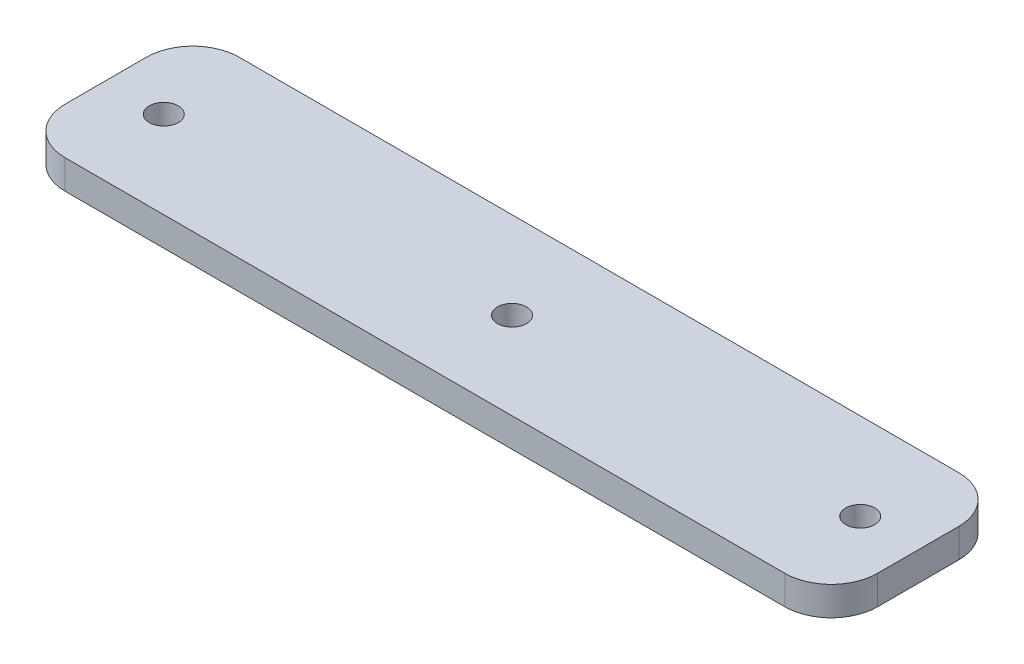
ISO-10303-21;
HEADER;
FILE_DESCRIPTION(('STEP AP214'),'2;1');
FILE_NAME('part.step','',(''),(''),'','','');
FILE_SCHEMA(('AUTOMOTIVE_DESIGN { 1 0 10303 214 1 1 1 1 }'));
ENDSEC;
DATA;
#1=APPLICATION_CONTEXT('core data for automotive mechanical design processes');
#2=APPLICATION_PROTOCOL_DEFINITION('international standard','automotive_design',2000,#1);
#3=PRODUCT_CONTEXT('',#1,'mechanical');
#4=PRODUCT('Part','Part','',(#3));
#5=PRODUCT_RELATED_PRODUCT_CATEGORY('part','',(#4));
#6=PRODUCT_DEFINITION_FORMATION('','',#4);
#7=PRODUCT_DEFINITION_CONTEXT('part definition',#1,'design');
#8=PRODUCT_DEFINITION('design','',#6,#7);
#9=PRODUCT_DEFINITION_SHAPE('','',#8);
#10=(LENGTH_UNIT() NAMED_UNIT(*) SI_UNIT(.MILLI.,.METRE.));
#11=(NAMED_UNIT(*) PLANE_ANGLE_UNIT() SI_UNIT($,.RADIAN.));
#12=(NAMED_UNIT(*) SI_UNIT($,.STERADIAN.) SOLID_ANGLE_UNIT());
#13=UNCERTAINTY_MEASURE_WITH_UNIT(LENGTH_MEASURE(1.E-05),#10,'distance_accuracy_value','');
#14=(GEOMETRIC_REPRESENTATION_CONTEXT(3) GLOBAL_UNCERTAINTY_ASSIGNED_CONTEXT((#13)) GLOBAL_UNIT_ASSIGNED_CONTEXT((#10,
#11,#12)) REPRESENTATION_CONTEXT('',''));
#15=CARTESIAN_POINT('',(0.,0.,0.));
#16=DIRECTION('',(0.,0.,1.));
#17=DIRECTION('',(1.,0.,0.));
#18=AXIS2_PLACEMENT_3D('',#15,#16,#17);
#19=CARTESIAN_POINT('',(167.64,6.35,10.16));
#20=DIRECTION('',(0.,1.,0.));
#21=DIRECTION('',(0.,0.,1.));
#22=AXIS2_PLACEMENT_3D('',#19,#20,#21);
#23=PLANE('',#22);
#24=CARTESIAN_POINT('',(88.9,6.35,19.05));
#25=DIRECTION('',(0.,1.,0.));
#26=DIRECTION('',(0.,0.,1.));
#27=AXIS2_PLACEMENT_3D('',#24,#25,#26);
#28=CIRCLE('',#27,3.175);
#29=CARTESIAN_POINT('',(88.9,6.35,22.225));
#30=VERTEX_POINT('',#29);
#31=EDGE_CURVE('E213',#30,#30,#28,.T.);
#32=ORIENTED_EDGE('',*,*,#31,.F.);
#33=EDGE_LOOP('',(#32));
#34=FACE_BOUND('',#33,.T.);
#35=CARTESIAN_POINT('',(167.64,6.35,10.16));
#36=DIRECTION('',(0.,1.,0.));
#37=DIRECTION('',(0.,0.,1.));
#38=AXIS2_PLACEMENT_3D('',#35,#36,#37);
#39=CIRCLE('',#38,10.16);
#40=CARTESIAN_POINT('',(177.8,6.35,10.16));
#41=VERTEX_POINT('',#40);
#42=CARTESIAN_POINT('',(167.64,6.35,0.));
#43=VERTEX_POINT('',#42);
#44=EDGE_CURVE('E164',#41,#43,#39,.T.);
#45=ORIENTED_EDGE('',*,*,#44,.T.);
#46=DIRECTION('',(-1.,0.,0.));
#47=VECTOR('',#46,1.);
#48=CARTESIAN_POINT('',(10.1600000000001,6.35,0.));
#49=LINE('',#48,#47);
#50=CARTESIAN_POINT('',(10.16,6.35,0.));
#51=VERTEX_POINT('',#50);
#52=EDGE_CURVE('E100',#43,#51,#49,.T.);
#53=ORIENTED_EDGE('',*,*,#52,.T.);
#54=CARTESIAN_POINT('',(10.16,6.35,10.16));
#55=DIRECTION('',(0.,1.,0.));
#56=DIRECTION('',(0.,0.,-1.));
#57=AXIS2_PLACEMENT_3D('',#54,#55,#56);
#58=CIRCLE('',#57,10.16);
#59=CARTESIAN_POINT('',(0.,6.35,10.1600000000001));
#60=VERTEX_POINT('',#59);
#61=EDGE_CURVE('E185',#51,#60,#58,.T.);
#62=ORIENTED_EDGE('',*,*,#61,.T.);
#63=DIRECTION('',(0.,0.,1.));
#64=VECTOR('',#63,1.);
#65=CARTESIAN_POINT('',(0.,6.35,10.1600000000001));
#66=LINE('',#65,#64);
#67=CARTESIAN_POINT('',(0.,6.35,27.9399999999999));
#68=VERTEX_POINT('',#67);
#69=EDGE_CURVE('E199',#60,#68,#66,.T.);
#70=ORIENTED_EDGE('',*,*,#69,.T.);
#71=CARTESIAN_POINT('',(10.16,6.35,27.94));
#72=DIRECTION('',(0.,1.,0.));
#73=DIRECTION('',(0.,0.,1.));
#74=AXIS2_PLACEMENT_3D('',#71,#72,#73);
#75=CIRCLE('',#74,10.16);
#76=CARTESIAN_POINT('',(10.1600000000001,6.35,38.1));
#77=VERTEX_POINT('',#76);
#78=EDGE_CURVE('E119',#68,#77,#75,.T.);
#79=ORIENTED_EDGE('',*,*,#78,.T.);
#80=DIRECTION('',(1.,0.,0.));
#81=VECTOR('',#80,1.);
#82=CARTESIAN_POINT('',(10.1600000000001,6.35,38.1));
#83=LINE('',#82,#81);
#84=CARTESIAN_POINT('',(167.64,6.35,38.1));
#85=VERTEX_POINT('',#84);
#86=EDGE_CURVE('E113',#77,#85,#83,.T.);
#87=ORIENTED_EDGE('',*,*,#86,.T.);
#88=CARTESIAN_POINT('',(167.64,6.35,27.94));
#89=DIRECTION('',(0.,1.,0.));
#90=DIRECTION('',(0.,0.,-1.));
#91=AXIS2_PLACEMENT_3D('',#88,#89,#90);
#92=CIRCLE('',#91,10.16);
#93=CARTESIAN_POINT('',(177.8,6.35,27.94));
#94=VERTEX_POINT('',#93);
#95=EDGE_CURVE('E117',#85,#94,#92,.T.);
#96=ORIENTED_EDGE('',*,*,#95,.T.);
#97=DIRECTION('',(0.,0.,-1.));
#98=VECTOR('',#97,1.);
#99=CARTESIAN_POINT('',(177.8,6.35,10.16));
#100=LINE('',#99,#98);
#101=EDGE_CURVE('E57',#94,#41,#100,.T.);
#102=ORIENTED_EDGE('',*,*,#101,.T.);
#103=EDGE_LOOP('',(#45,#53,#62,#70,#79,#87,#96,#102));
#104=FACE_BOUND('',#103,.T.);
#105=CARTESIAN_POINT('',(12.7,6.35,19.05));
#106=DIRECTION('',(0.,1.,0.));
#107=DIRECTION('',(0.,0.,1.));
#108=AXIS2_PLACEMENT_3D('',#105,#106,#107);
#109=CIRCLE('',#108,3.175);
#110=CARTESIAN_POINT('',(12.7,6.35,22.225));
#111=VERTEX_POINT('',#110);
#112=EDGE_CURVE('E146',#111,#111,#109,.T.);
#113=ORIENTED_EDGE('',*,*,#112,.F.);
#114=EDGE_LOOP('',(#113));
#115=FACE_BOUND('',#114,.T.);
#116=CARTESIAN_POINT('',(165.1,6.35,19.05));
#117=DIRECTION('',(0.,1.,0.));
#118=DIRECTION('',(0.,0.,1.));
#119=AXIS2_PLACEMENT_3D('',#116,#117,#118);
#120=CIRCLE('',#119,3.175);
#121=CARTESIAN_POINT('',(165.1,6.35,22.225));
#122=VERTEX_POINT('',#121);
#123=EDGE_CURVE('E221',#122,#122,#120,.T.);
#124=ORIENTED_EDGE('',*,*,#123,.F.);
#125=EDGE_LOOP('',(#124));
#126=FACE_BOUND('',#125,.T.);
#127=ADVANCED_FACE('F39',(#34,#104,#115,#126),#23,.T.);
#128=CARTESIAN_POINT('',(167.64,0.,10.16));
#129=DIRECTION('',(0.,1.,0.));
#130=DIRECTION('',(0.,0.,1.));
#131=AXIS2_PLACEMENT_3D('',#128,#129,#130);
#132=PLANE('',#131);
#133=CARTESIAN_POINT('',(167.64,0.,10.16));
#134=DIRECTION('',(0.,1.,0.));
#135=DIRECTION('',(0.,0.,1.));
#136=AXIS2_PLACEMENT_3D('',#133,#134,#135);
#137=CIRCLE('',#136,10.16);
#138=CARTESIAN_POINT('',(177.8,0.,10.16));
#139=VERTEX_POINT('',#138);
#140=CARTESIAN_POINT('',(167.64,0.,0.));
#141=VERTEX_POINT('',#140);
#142=EDGE_CURVE('E141',#139,#141,#137,.T.);
#143=ORIENTED_EDGE('',*,*,#142,.F.);
#144=DIRECTION('',(0.,0.,-1.));
#145=VECTOR('',#144,1.);
#146=CARTESIAN_POINT('',(177.8,0.,10.16));
#147=LINE('',#146,#145);
#148=CARTESIAN_POINT('',(177.8,0.,27.94));
#149=VERTEX_POINT('',#148);
#150=EDGE_CURVE('E92',#149,#139,#147,.T.);
#151=ORIENTED_EDGE('',*,*,#150,.F.);
#152=CARTESIAN_POINT('',(167.64,0.,27.94));
#153=DIRECTION('',(0.,1.,0.));
#154=DIRECTION('',(0.,0.,-1.));
#155=AXIS2_PLACEMENT_3D('',#152,#153,#154);
#156=CIRCLE('',#155,10.16);
#157=CARTESIAN_POINT('',(167.64,0.,38.1));
#158=VERTEX_POINT('',#157);
#159=EDGE_CURVE('E86',#158,#149,#156,.T.);
#160=ORIENTED_EDGE('',*,*,#159,.F.);
#161=DIRECTION('',(1.,0.,0.));
#162=VECTOR('',#161,1.);
#163=CARTESIAN_POINT('',(10.1600000000001,0.,38.1));
#164=LINE('',#163,#162);
#165=CARTESIAN_POINT('',(10.1600000000001,0.,38.1));
#166=VERTEX_POINT('',#165);
#167=EDGE_CURVE('E128',#166,#158,#164,.T.);
#168=ORIENTED_EDGE('',*,*,#167,.F.);
#169=CARTESIAN_POINT('',(10.16,0.,27.94));
#170=DIRECTION('',(0.,1.,0.));
#171=DIRECTION('',(0.,0.,1.));
#172=AXIS2_PLACEMENT_3D('',#169,#170,#171);
#173=CIRCLE('',#172,10.16);
#174=CARTESIAN_POINT('',(0.,0.,27.9399999999999));
#175=VERTEX_POINT('',#174);
#176=EDGE_CURVE('E155',#175,#166,#173,.T.);
#177=ORIENTED_EDGE('',*,*,#176,.F.);
#178=DIRECTION('',(0.,0.,1.));
#179=VECTOR('',#178,1.);
#180=CARTESIAN_POINT('',(0.,0.,10.1600000000001));
#181=LINE('',#180,#179);
#182=CARTESIAN_POINT('',(0.,0.,10.1600000000001));
#183=VERTEX_POINT('',#182);
#184=EDGE_CURVE('E152',#183,#175,#181,.T.);
#185=ORIENTED_EDGE('',*,*,#184,.F.);
#186=CARTESIAN_POINT('',(10.16,0.,10.16));
#187=DIRECTION('',(0.,1.,0.));
#188=DIRECTION('',(0.,0.,-1.));
#189=AXIS2_PLACEMENT_3D('',#186,#187,#188);
#190=CIRCLE('',#189,10.16);
#191=CARTESIAN_POINT('',(10.16,0.,0.));
#192=VERTEX_POINT('',#191);
#193=EDGE_CURVE('E149',#192,#183,#190,.T.);
#194=ORIENTED_EDGE('',*,*,#193,.F.);
#195=DIRECTION('',(-1.,0.,0.));
#196=VECTOR('',#195,1.);
#197=CARTESIAN_POINT('',(10.1600000000001,0.,0.));
#198=LINE('',#197,#196);
#199=EDGE_CURVE('E145',#141,#192,#198,.T.);
#200=ORIENTED_EDGE('',*,*,#199,.F.);
#201=EDGE_LOOP('',(#143,#151,#160,#168,#177,#185,#194,#200));
#202=FACE_BOUND('',#201,.T.);
#203=CARTESIAN_POINT('',(12.7,0.,19.05));
#204=DIRECTION('',(0.,1.,0.));
#205=DIRECTION('',(0.,0.,1.));
#206=AXIS2_PLACEMENT_3D('',#203,#204,#205);
#207=CIRCLE('',#206,3.175);
#208=CARTESIAN_POINT('',(12.7,0.,22.225));
#209=VERTEX_POINT('',#208);
#210=EDGE_CURVE('E209',#209,#209,#207,.T.);
#211=ORIENTED_EDGE('',*,*,#210,.T.);
#212=EDGE_LOOP('',(#211));
#213=FACE_BOUND('',#212,.T.);
#214=CARTESIAN_POINT('',(88.9,0.,19.05));
#215=DIRECTION('',(0.,1.,0.));
#216=DIRECTION('',(0.,0.,1.));
#217=AXIS2_PLACEMENT_3D('',#214,#215,#216);
#218=CIRCLE('',#217,3.175);
#219=CARTESIAN_POINT('',(88.9,0.,22.225));
#220=VERTEX_POINT('',#219);
#221=EDGE_CURVE('E217',#220,#220,#218,.T.);
#222=ORIENTED_EDGE('',*,*,#221,.T.);
#223=EDGE_LOOP('',(#222));
#224=FACE_BOUND('',#223,.T.);
#225=CARTESIAN_POINT('',(165.1,0.,19.05));
#226=DIRECTION('',(0.,1.,0.));
#227=DIRECTION('',(0.,0.,1.));
#228=AXIS2_PLACEMENT_3D('',#225,#226,#227);
#229=CIRCLE('',#228,3.175);
#230=CARTESIAN_POINT('',(165.1,0.,22.225));
#231=VERTEX_POINT('',#230);
#232=EDGE_CURVE('E225',#231,#231,#229,.T.);
#233=ORIENTED_EDGE('',*,*,#232,.T.);
#234=EDGE_LOOP('',(#233));
#235=FACE_BOUND('',#234,.T.);
#236=ADVANCED_FACE('F189',(#202,#213,#224,#235),#132,.F.);
#237=CARTESIAN_POINT('',(167.64,6.35,10.16));
#238=DIRECTION('',(0.,-1.,0.));
#239=DIRECTION('',(0.,0.,-1.));
#240=AXIS2_PLACEMENT_3D('',#237,#238,#239);
#241=CYLINDRICAL_SURFACE('',#240,10.16);
#242=ORIENTED_EDGE('',*,*,#142,.T.);
#243=DIRECTION('',(0.,-1.,0.));
#244=VECTOR('',#243,1.);
#245=CARTESIAN_POINT('',(167.64,6.35,0.));
#246=LINE('',#245,#244);
#247=EDGE_CURVE('E11',#43,#141,#246,.T.);
#248=ORIENTED_EDGE('',*,*,#247,.F.);
#249=ORIENTED_EDGE('',*,*,#44,.F.);
#250=DIRECTION('',(0.,-1.,0.));
#251=VECTOR('',#250,1.);
#252=CARTESIAN_POINT('',(177.8,6.35,10.16));
#253=LINE('',#252,#251);
#254=EDGE_CURVE('E137',#41,#139,#253,.T.);
#255=ORIENTED_EDGE('',*,*,#254,.T.);
#256=EDGE_LOOP('',(#242,#248,#249,#255));
#257=FACE_BOUND('',#256,.T.);
#258=ADVANCED_FACE('F41',(#257),#241,.T.);
#259=CARTESIAN_POINT('',(10.1600000000001,6.35,0.));
#260=DIRECTION('',(0.,0.,1.));
#261=DIRECTION('',(1.,0.,0.));
#262=AXIS2_PLACEMENT_3D('',#259,#260,#261);
#263=PLANE('',#262);
#264=ORIENTED_EDGE('',*,*,#199,.T.);
#265=DIRECTION('',(0.,-1.,0.));
#266=VECTOR('',#265,1.);
#267=CARTESIAN_POINT('',(10.16,6.35,0.));
#268=LINE('',#267,#266);
#269=EDGE_CURVE('E49',#51,#192,#268,.T.);
#270=ORIENTED_EDGE('',*,*,#269,.F.);
#271=ORIENTED_EDGE('',*,*,#52,.F.);
#272=ORIENTED_EDGE('',*,*,#247,.T.);
#273=EDGE_LOOP('',(#264,#270,#271,#272));
#274=FACE_BOUND('',#273,.T.);
#275=ADVANCED_FACE('F260',(#274),#263,.F.);
#276=CARTESIAN_POINT('',(10.16,6.35,10.16));
#277=DIRECTION('',(0.,-1.,0.));
#278=DIRECTION('',(0.,0.,-1.));
#279=AXIS2_PLACEMENT_3D('',#276,#277,#278);
#280=CYLINDRICAL_SURFACE('',#279,10.16);
#281=ORIENTED_EDGE('',*,*,#193,.T.);
#282=DIRECTION('',(0.,-1.,0.));
#283=VECTOR('',#282,1.);
#284=CARTESIAN_POINT('',(0.,6.35,10.1600000000001));
#285=LINE('',#284,#283);
#286=EDGE_CURVE('E175',#60,#183,#285,.T.);
#287=ORIENTED_EDGE('',*,*,#286,.F.);
#288=ORIENTED_EDGE('',*,*,#61,.F.);
#289=ORIENTED_EDGE('',*,*,#269,.T.);
#290=EDGE_LOOP('',(#281,#287,#288,#289));
#291=FACE_BOUND('',#290,.T.);
#292=ADVANCED_FACE('F183',(#291),#280,.T.);
#293=CARTESIAN_POINT('',(0.,6.35,10.1600000000001));
#294=DIRECTION('',(1.,0.,0.));
#295=DIRECTION('',(0.,0.,-1.));
#296=AXIS2_PLACEMENT_3D('',#293,#294,#295);
#297=PLANE('',#296);
#298=ORIENTED_EDGE('',*,*,#184,.T.);
#299=DIRECTION('',(0.,-1.,0.));
#300=VECTOR('',#299,1.);
#301=CARTESIAN_POINT('',(0.,6.35,27.9399999999999));
#302=LINE('',#301,#300);
#303=EDGE_CURVE('E171',#68,#175,#302,.T.);
#304=ORIENTED_EDGE('',*,*,#303,.F.);
#305=ORIENTED_EDGE('',*,*,#69,.F.);
#306=ORIENTED_EDGE('',*,*,#286,.T.);
#307=EDGE_LOOP('',(#298,#304,#305,#306));
#308=FACE_BOUND('',#307,.T.);
#309=ADVANCED_FACE('F194',(#308),#297,.F.);
#310=CARTESIAN_POINT('',(10.16,6.35,27.94));
#311=DIRECTION('',(0.,-1.,0.));
#312=DIRECTION('',(0.,0.,-1.));
#313=AXIS2_PLACEMENT_3D('',#310,#311,#312);
#314=CYLINDRICAL_SURFACE('',#313,10.16);
#315=ORIENTED_EDGE('',*,*,#176,.T.);
#316=DIRECTION('',(0.,-1.,0.));
#317=VECTOR('',#316,1.);
#318=CARTESIAN_POINT('',(10.1600000000001,6.35,38.1));
#319=LINE('',#318,#317);
#320=EDGE_CURVE('E130',#77,#166,#319,.T.);
#321=ORIENTED_EDGE('',*,*,#320,.F.);
#322=ORIENTED_EDGE('',*,*,#78,.F.);
#323=ORIENTED_EDGE('',*,*,#303,.T.);
#324=EDGE_LOOP('',(#315,#321,#322,#323));
#325=FACE_BOUND('',#324,.T.);
#326=ADVANCED_FACE('F197',(#325),#314,.T.);
#327=CARTESIAN_POINT('',(10.1600000000001,6.35,38.1));
#328=DIRECTION('',(0.,0.,-1.));
#329=DIRECTION('',(-1.,0.,0.));
#330=AXIS2_PLACEMENT_3D('',#327,#328,#329);
#331=PLANE('',#330);
#332=ORIENTED_EDGE('',*,*,#167,.T.);
#333=DIRECTION('',(0.,-1.,0.));
#334=VECTOR('',#333,1.);
#335=CARTESIAN_POINT('',(167.64,6.35,38.1));
#336=LINE('',#335,#334);
#337=EDGE_CURVE('E125',#85,#158,#336,.T.);
#338=ORIENTED_EDGE('',*,*,#337,.F.);
#339=ORIENTED_EDGE('',*,*,#86,.F.);
#340=ORIENTED_EDGE('',*,*,#320,.T.);
#341=EDGE_LOOP('',(#332,#338,#339,#340));
#342=FACE_BOUND('',#341,.T.);
#343=ADVANCED_FACE('F126',(#342),#331,.F.);
#344=CARTESIAN_POINT('',(167.64,6.35,27.94));
#345=DIRECTION('',(0.,-1.,0.));
#346=DIRECTION('',(0.,0.,-1.));
#347=AXIS2_PLACEMENT_3D('',#344,#345,#346);
#348=CYLINDRICAL_SURFACE('',#347,10.16);
#349=ORIENTED_EDGE('',*,*,#159,.T.);
#350=DIRECTION('',(0.,-1.,0.));
#351=VECTOR('',#350,1.);
#352=CARTESIAN_POINT('',(177.8,6.35,27.94));
#353=LINE('',#352,#351);
#354=EDGE_CURVE('E131',#94,#149,#353,.T.);
#355=ORIENTED_EDGE('',*,*,#354,.F.);
#356=ORIENTED_EDGE('',*,*,#95,.F.);
#357=ORIENTED_EDGE('',*,*,#337,.T.);
#358=EDGE_LOOP('',(#349,#355,#356,#357));
#359=FACE_BOUND('',#358,.T.);
#360=ADVANCED_FACE('F133',(#359),#348,.T.);
#361=CARTESIAN_POINT('',(177.8,6.35,10.16));
#362=DIRECTION('',(-1.,0.,0.));
#363=DIRECTION('',(0.,0.,1.));
#364=AXIS2_PLACEMENT_3D('',#361,#362,#363);
#365=PLANE('',#364);
#366=ORIENTED_EDGE('',*,*,#150,.T.);
#367=ORIENTED_EDGE('',*,*,#254,.F.);
#368=ORIENTED_EDGE('',*,*,#101,.F.);
#369=ORIENTED_EDGE('',*,*,#354,.T.);
#370=EDGE_LOOP('',(#366,#367,#368,#369));
#371=FACE_BOUND('',#370,.T.);
#372=ADVANCED_FACE('F248',(#371),#365,.F.);
#373=CARTESIAN_POINT('',(12.7,6.35,19.05));
#374=DIRECTION('',(0.,-1.,0.));
#375=DIRECTION('',(0.,0.,-1.));
#376=AXIS2_PLACEMENT_3D('',#373,#374,#375);
#377=CYLINDRICAL_SURFACE('',#376,3.175);
#378=ORIENTED_EDGE('',*,*,#112,.T.);
#379=EDGE_LOOP('',(#378));
#380=FACE_BOUND('',#379,.T.);
#381=ORIENTED_EDGE('',*,*,#210,.F.);
#382=EDGE_LOOP('',(#381));
#383=FACE_BOUND('',#382,.T.);
#384=ADVANCED_FACE('F245',(#380,#383),#377,.F.);
#385=CARTESIAN_POINT('',(88.9,6.35,19.05));
#386=DIRECTION('',(0.,-1.,0.));
#387=DIRECTION('',(0.,0.,-1.));
#388=AXIS2_PLACEMENT_3D('',#385,#386,#387);
#389=CYLINDRICAL_SURFACE('',#388,3.175);
#390=ORIENTED_EDGE('',*,*,#31,.T.);
#391=EDGE_LOOP('',(#390));
#392=FACE_BOUND('',#391,.T.);
#393=ORIENTED_EDGE('',*,*,#221,.F.);
#394=EDGE_LOOP('',(#393));
#395=FACE_BOUND('',#394,.T.);
#396=ADVANCED_FACE('F324',(#392,#395),#389,.F.);
#397=CARTESIAN_POINT('',(165.1,6.35,19.05));
#398=DIRECTION('',(0.,-1.,0.));
#399=DIRECTION('',(0.,0.,-1.));
#400=AXIS2_PLACEMENT_3D('',#397,#398,#399);
#401=CYLINDRICAL_SURFACE('',#400,3.175);
#402=ORIENTED_EDGE('',*,*,#123,.T.);
#403=EDGE_LOOP('',(#402));
#404=FACE_BOUND('',#403,.T.);
#405=ORIENTED_EDGE('',*,*,#232,.F.);
#406=EDGE_LOOP('',(#405));
#407=FACE_BOUND('',#406,.T.);
#408=ADVANCED_FACE('F233',(#404,#407),#401,.F.);
#409=CLOSED_SHELL('',(#127,#236,#258,#275,#292,#309,#326,#343,#360,#372,#384,#396,#408));
#410=MANIFOLD_SOLID_BREP('B2',#409);
#411=ADVANCED_BREP_SHAPE_REPRESENTATION('',(#18,#410),#14);
#412=SHAPE_DEFINITION_REPRESENTATION(#9,#411);
ENDSEC;
END-ISO-10303-21;
